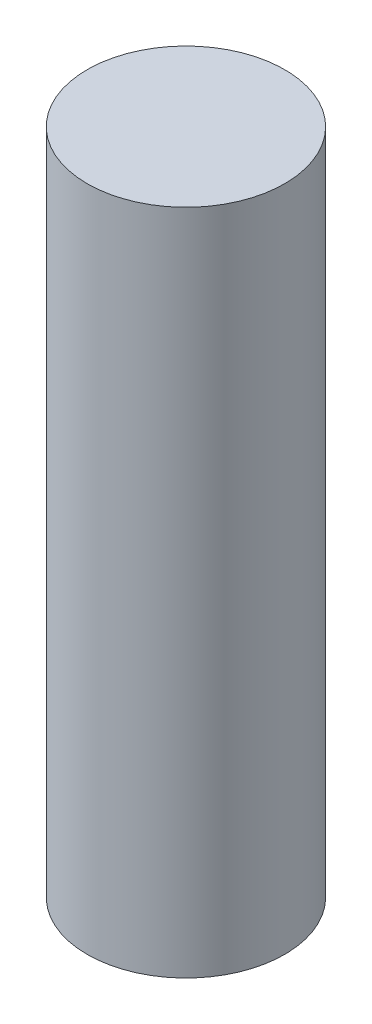
ISO-10303-21;
HEADER;
FILE_DESCRIPTION(('STEP AP214'),'2;1');
FILE_NAME('part.step','',(''),(''),'','','');
FILE_SCHEMA(('AUTOMOTIVE_DESIGN { 1 0 10303 214 1 1 1 1 }'));
ENDSEC;
DATA;
#1=APPLICATION_CONTEXT('core data for automotive mechanical design processes');
#2=APPLICATION_PROTOCOL_DEFINITION('international standard','automotive_design',2000,#1);
#3=PRODUCT_CONTEXT('',#1,'mechanical');
#4=PRODUCT('Part','Part','',(#3));
#5=PRODUCT_RELATED_PRODUCT_CATEGORY('part','',(#4));
#6=PRODUCT_DEFINITION_FORMATION('','',#4);
#7=PRODUCT_DEFINITION_CONTEXT('part definition',#1,'design');
#8=PRODUCT_DEFINITION('design','',#6,#7);
#9=PRODUCT_DEFINITION_SHAPE('','',#8);
#10=(LENGTH_UNIT() NAMED_UNIT(*) SI_UNIT(.MILLI.,.METRE.));
#11=(NAMED_UNIT(*) PLANE_ANGLE_UNIT() SI_UNIT($,.RADIAN.));
#12=(NAMED_UNIT(*) SI_UNIT($,.STERADIAN.) SOLID_ANGLE_UNIT());
#13=UNCERTAINTY_MEASURE_WITH_UNIT(LENGTH_MEASURE(1.E-05),#10,'distance_accuracy_value','');
#14=(GEOMETRIC_REPRESENTATION_CONTEXT(3) GLOBAL_UNCERTAINTY_ASSIGNED_CONTEXT((#13)) GLOBAL_UNIT_ASSIGNED_CONTEXT((#10,
#11,#12)) REPRESENTATION_CONTEXT('',''));
#15=CARTESIAN_POINT('',(0.,0.,0.));
#16=DIRECTION('',(0.,0.,1.));
#17=DIRECTION('',(1.,0.,0.));
#18=AXIS2_PLACEMENT_3D('',#15,#16,#17);
#19=CARTESIAN_POINT('',(0.,100.,0.));
#20=DIRECTION('',(0.,-1.,0.));
#21=DIRECTION('',(0.,0.,-1.));
#22=AXIS2_PLACEMENT_3D('',#19,#20,#21);
#23=CYLINDRICAL_SURFACE('',#22,14.8);
#24=CARTESIAN_POINT('',(0.,100.,0.));
#25=DIRECTION('',(0.,1.,0.));
#26=DIRECTION('',(0.,0.,1.));
#27=AXIS2_PLACEMENT_3D('',#24,#25,#26);
#28=CIRCLE('',#27,14.8);
#29=CARTESIAN_POINT('',(0.,100.,14.8));
#30=VERTEX_POINT('',#29);
#31=EDGE_CURVE('E10',#30,#30,#28,.T.);
#32=ORIENTED_EDGE('',*,*,#31,.F.);
#33=EDGE_LOOP('',(#32));
#34=FACE_BOUND('',#33,.T.);
#35=CARTESIAN_POINT('',(0.,0.,0.));
#36=DIRECTION('',(0.,1.,0.));
#37=DIRECTION('',(0.,0.,1.));
#38=AXIS2_PLACEMENT_3D('',#35,#36,#37);
#39=CIRCLE('',#38,14.8);
#40=CARTESIAN_POINT('',(0.,0.,14.8));
#41=VERTEX_POINT('',#40);
#42=EDGE_CURVE('E40',#41,#41,#39,.T.);
#43=ORIENTED_EDGE('',*,*,#42,.T.);
#44=EDGE_LOOP('',(#43));
#45=FACE_BOUND('',#44,.T.);
#46=ADVANCED_FACE('F37',(#34,#45),#23,.T.);
#47=CARTESIAN_POINT('',(0.,100.,0.));
#48=DIRECTION('',(0.,1.,0.));
#49=DIRECTION('',(0.,0.,1.));
#50=AXIS2_PLACEMENT_3D('',#47,#48,#49);
#51=PLANE('',#50);
#52=ORIENTED_EDGE('',*,*,#31,.T.);
#53=EDGE_LOOP('',(#52));
#54=FACE_BOUND('',#53,.T.);
#55=ADVANCED_FACE('F52',(#54),#51,.T.);
#56=CARTESIAN_POINT('',(0.,0.,0.));
#57=DIRECTION('',(0.,1.,0.));
#58=DIRECTION('',(0.,0.,1.));
#59=AXIS2_PLACEMENT_3D('',#56,#57,#58);
#60=PLANE('',#59);
#61=ORIENTED_EDGE('',*,*,#42,.F.);
#62=EDGE_LOOP('',(#61));
#63=FACE_BOUND('',#62,.T.);
#64=ADVANCED_FACE('F50',(#63),#60,.F.);
#65=CLOSED_SHELL('',(#46,#55,#64));
#66=MANIFOLD_SOLID_BREP('B2',#65);
#67=ADVANCED_BREP_SHAPE_REPRESENTATION('',(#18,#66),#14);
#68=SHAPE_DEFINITION_REPRESENTATION(#9,#67);
ENDSEC;
END-ISO-10303-21;
